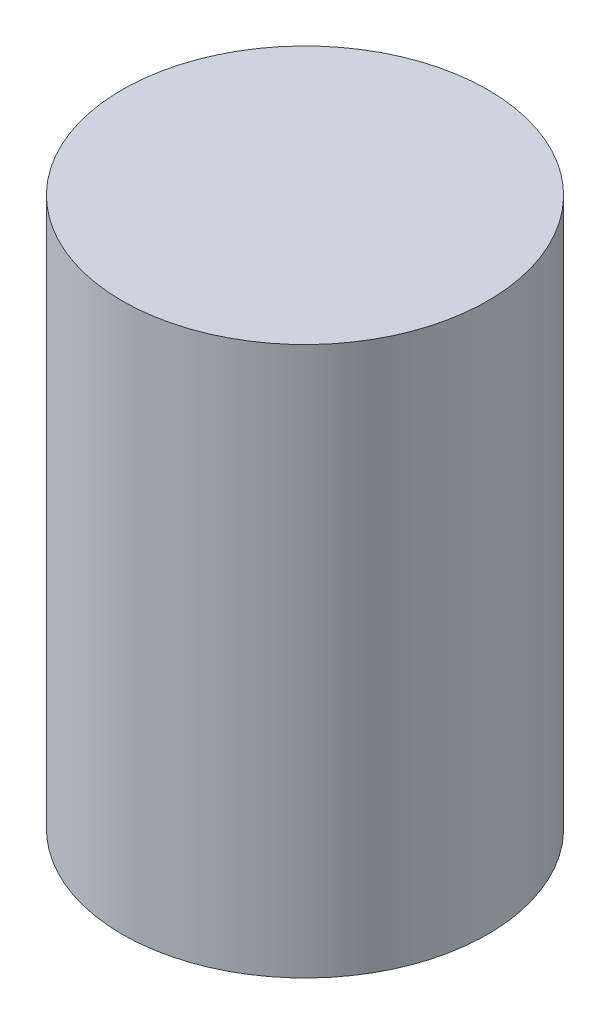
ISO-10303-21;
HEADER;
FILE_DESCRIPTION(('STEP AP214'),'2;1');
FILE_NAME('part.step','',(''),(''),'','','');
FILE_SCHEMA(('AUTOMOTIVE_DESIGN { 1 0 10303 214 1 1 1 1 }'));
ENDSEC;
DATA;
#1=APPLICATION_CONTEXT('core data for automotive mechanical design processes');
#2=APPLICATION_PROTOCOL_DEFINITION('international standard','automotive_design',2000,#1);
#3=PRODUCT_CONTEXT('',#1,'mechanical');
#4=PRODUCT('Part','Part','',(#3));
#5=PRODUCT_RELATED_PRODUCT_CATEGORY('part','',(#4));
#6=PRODUCT_DEFINITION_FORMATION('','',#4);
#7=PRODUCT_DEFINITION_CONTEXT('part definition',#1,'design');
#8=PRODUCT_DEFINITION('design','',#6,#7);
#9=PRODUCT_DEFINITION_SHAPE('','',#8);
#10=(LENGTH_UNIT() NAMED_UNIT(*) SI_UNIT(.MILLI.,.METRE.));
#11=(NAMED_UNIT(*) PLANE_ANGLE_UNIT() SI_UNIT($,.RADIAN.));
#12=(NAMED_UNIT(*) SI_UNIT($,.STERADIAN.) SOLID_ANGLE_UNIT());
#13=UNCERTAINTY_MEASURE_WITH_UNIT(LENGTH_MEASURE(1.E-05),#10,'distance_accuracy_value','');
#14=(GEOMETRIC_REPRESENTATION_CONTEXT(3) GLOBAL_UNCERTAINTY_ASSIGNED_CONTEXT((#13)) GLOBAL_UNIT_ASSIGNED_CONTEXT((#10,
#11,#12)) REPRESENTATION_CONTEXT('',''));
#15=CARTESIAN_POINT('',(0.,0.,0.));
#16=DIRECTION('',(0.,0.,1.));
#17=DIRECTION('',(1.,0.,0.));
#18=AXIS2_PLACEMENT_3D('',#15,#16,#17);
#19=CARTESIAN_POINT('',(0.,60.,0.));
#20=DIRECTION('',(0.,-1.,0.));
#21=DIRECTION('',(0.,0.,-1.));
#22=AXIS2_PLACEMENT_3D('',#19,#20,#21);
#23=CYLINDRICAL_SURFACE('',#22,20.);
#24=CARTESIAN_POINT('',(0.,60.,0.));
#25=DIRECTION('',(0.,1.,0.));
#26=DIRECTION('',(0.,0.,1.));
#27=AXIS2_PLACEMENT_3D('',#24,#25,#26);
#28=CIRCLE('',#27,20.);
#29=CARTESIAN_POINT('',(0.,60.,20.));
#30=VERTEX_POINT('',#29);
#31=EDGE_CURVE('E10',#30,#30,#28,.T.);
#32=ORIENTED_EDGE('',*,*,#31,.F.);
#33=EDGE_LOOP('',(#32));
#34=FACE_BOUND('',#33,.T.);
#35=CARTESIAN_POINT('',(0.,0.,0.));
#36=DIRECTION('',(0.,1.,0.));
#37=DIRECTION('',(0.,0.,1.));
#38=AXIS2_PLACEMENT_3D('',#35,#36,#37);
#39=CIRCLE('',#38,20.);
#40=CARTESIAN_POINT('',(0.,0.,20.));
#41=VERTEX_POINT('',#40);
#42=EDGE_CURVE('E34',#41,#41,#39,.T.);
#43=ORIENTED_EDGE('',*,*,#42,.T.);
#44=EDGE_LOOP('',(#43));
#45=FACE_BOUND('',#44,.T.);
#46=ADVANCED_FACE('F31',(#34,#45),#23,.T.);
#47=CARTESIAN_POINT('',(0.,60.,0.));
#48=DIRECTION('',(0.,1.,0.));
#49=DIRECTION('',(0.,0.,1.));
#50=AXIS2_PLACEMENT_3D('',#47,#48,#49);
#51=PLANE('',#50);
#52=ORIENTED_EDGE('',*,*,#31,.T.);
#53=EDGE_LOOP('',(#52));
#54=FACE_BOUND('',#53,.T.);
#55=ADVANCED_FACE('F46',(#54),#51,.T.);
#56=CARTESIAN_POINT('',(0.,0.,0.));
#57=DIRECTION('',(0.,1.,0.));
#58=DIRECTION('',(0.,0.,1.));
#59=AXIS2_PLACEMENT_3D('',#56,#57,#58);
#60=PLANE('',#59);
#61=ORIENTED_EDGE('',*,*,#42,.F.);
#62=EDGE_LOOP('',(#61));
#63=FACE_BOUND('',#62,.T.);
#64=ADVANCED_FACE('F44',(#63),#60,.F.);
#65=CLOSED_SHELL('',(#46,#55,#64));
#66=MANIFOLD_SOLID_BREP('B2',#65);
#67=ADVANCED_BREP_SHAPE_REPRESENTATION('',(#18,#66),#14);
#68=SHAPE_DEFINITION_REPRESENTATION(#9,#67);
ENDSEC;
END-ISO-10303-21;
